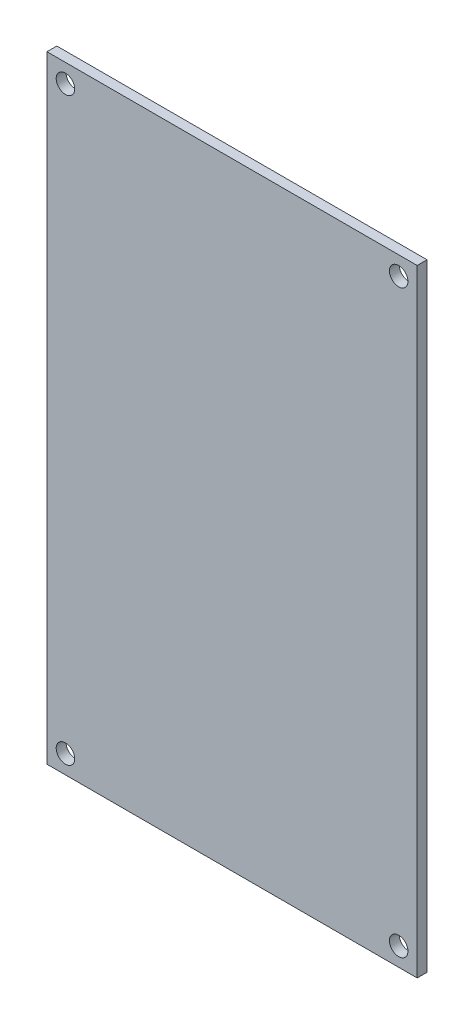
ISO-10303-21;
HEADER;
FILE_DESCRIPTION(('STEP AP214'),'2;1');
FILE_NAME('part.step','',(''),(''),'','','');
FILE_SCHEMA(('AUTOMOTIVE_DESIGN { 1 0 10303 214 1 1 1 1 }'));
ENDSEC;
DATA;
#1=APPLICATION_CONTEXT('core data for automotive mechanical design processes');
#2=APPLICATION_PROTOCOL_DEFINITION('international standard','automotive_design',2000,#1);
#3=PRODUCT_CONTEXT('',#1,'mechanical');
#4=PRODUCT('Part','Part','',(#3));
#5=PRODUCT_RELATED_PRODUCT_CATEGORY('part','',(#4));
#6=PRODUCT_DEFINITION_FORMATION('','',#4);
#7=PRODUCT_DEFINITION_CONTEXT('part definition',#1,'design');
#8=PRODUCT_DEFINITION('design','',#6,#7);
#9=PRODUCT_DEFINITION_SHAPE('','',#8);
#10=(LENGTH_UNIT() NAMED_UNIT(*) SI_UNIT(.MILLI.,.METRE.));
#11=(NAMED_UNIT(*) PLANE_ANGLE_UNIT() SI_UNIT($,.RADIAN.));
#12=(NAMED_UNIT(*) SI_UNIT($,.STERADIAN.) SOLID_ANGLE_UNIT());
#13=UNCERTAINTY_MEASURE_WITH_UNIT(LENGTH_MEASURE(1.E-05),#10,'distance_accuracy_value','');
#14=(GEOMETRIC_REPRESENTATION_CONTEXT(3) GLOBAL_UNCERTAINTY_ASSIGNED_CONTEXT((#13)) GLOBAL_UNIT_ASSIGNED_CONTEXT((#10,
#11,#12)) REPRESENTATION_CONTEXT('',''));
#15=CARTESIAN_POINT('',(0.,0.,0.));
#16=DIRECTION('',(0.,0.,1.));
#17=DIRECTION('',(1.,0.,0.));
#18=AXIS2_PLACEMENT_3D('',#15,#16,#17);
#19=CARTESIAN_POINT('',(0.,0.,1.6));
#20=DIRECTION('',(0.,0.,-1.));
#21=DIRECTION('',(-1.,0.,0.));
#22=AXIS2_PLACEMENT_3D('',#19,#20,#21);
#23=PLANE('',#22);
#24=DIRECTION('',(0.,-1.,0.));
#25=VECTOR('',#24,1.);
#26=CARTESIAN_POINT('',(0.,0.,1.6));
#27=LINE('',#26,#25);
#28=CARTESIAN_POINT('',(0.,100.,1.6));
#29=VERTEX_POINT('',#28);
#30=CARTESIAN_POINT('',(0.,0.,1.6));
#31=VERTEX_POINT('',#30);
#32=EDGE_CURVE('E92',#29,#31,#27,.T.);
#33=ORIENTED_EDGE('',*,*,#32,.T.);
#34=DIRECTION('',(1.,0.,0.));
#35=VECTOR('',#34,1.);
#36=CARTESIAN_POINT('',(0.,0.,1.6));
#37=LINE('',#36,#35);
#38=CARTESIAN_POINT('',(60.,0.,1.6));
#39=VERTEX_POINT('',#38);
#40=EDGE_CURVE('E87',#31,#39,#37,.T.);
#41=ORIENTED_EDGE('',*,*,#40,.T.);
#42=DIRECTION('',(0.,1.,0.));
#43=VECTOR('',#42,1.);
#44=CARTESIAN_POINT('',(60.,0.,1.6));
#45=LINE('',#44,#43);
#46=CARTESIAN_POINT('',(60.,100.,1.6));
#47=VERTEX_POINT('',#46);
#48=EDGE_CURVE('E90',#39,#47,#45,.T.);
#49=ORIENTED_EDGE('',*,*,#48,.T.);
#50=DIRECTION('',(-1.,0.,0.));
#51=VECTOR('',#50,1.);
#52=CARTESIAN_POINT('',(0.,100.,1.6));
#53=LINE('',#52,#51);
#54=EDGE_CURVE('E57',#47,#29,#53,.T.);
#55=ORIENTED_EDGE('',*,*,#54,.T.);
#56=EDGE_LOOP('',(#33,#41,#49,#55));
#57=FACE_BOUND('',#56,.T.);
#58=CARTESIAN_POINT('',(3.,3.,1.6));
#59=DIRECTION('',(0.,0.,1.));
#60=DIRECTION('',(1.,0.,0.));
#61=AXIS2_PLACEMENT_3D('',#58,#59,#60);
#62=CIRCLE('',#61,1.5);
#63=CARTESIAN_POINT('',(4.5,3.,1.6));
#64=VERTEX_POINT('',#63);
#65=EDGE_CURVE('E112',#64,#64,#62,.T.);
#66=ORIENTED_EDGE('',*,*,#65,.F.);
#67=EDGE_LOOP('',(#66));
#68=FACE_BOUND('',#67,.T.);
#69=CARTESIAN_POINT('',(57.,3.,1.6));
#70=DIRECTION('',(0.,0.,1.));
#71=DIRECTION('',(1.,0.,0.));
#72=AXIS2_PLACEMENT_3D('',#69,#70,#71);
#73=CIRCLE('',#72,1.5);
#74=CARTESIAN_POINT('',(58.5,3.,1.6));
#75=VERTEX_POINT('',#74);
#76=EDGE_CURVE('E134',#75,#75,#73,.T.);
#77=ORIENTED_EDGE('',*,*,#76,.F.);
#78=EDGE_LOOP('',(#77));
#79=FACE_BOUND('',#78,.T.);
#80=CARTESIAN_POINT('',(57.,97.,1.6));
#81=DIRECTION('',(0.,0.,1.));
#82=DIRECTION('',(1.,0.,0.));
#83=AXIS2_PLACEMENT_3D('',#80,#81,#82);
#84=CIRCLE('',#83,1.5);
#85=CARTESIAN_POINT('',(58.5,97.,1.6));
#86=VERTEX_POINT('',#85);
#87=EDGE_CURVE('E142',#86,#86,#84,.T.);
#88=ORIENTED_EDGE('',*,*,#87,.F.);
#89=EDGE_LOOP('',(#88));
#90=FACE_BOUND('',#89,.T.);
#91=CARTESIAN_POINT('',(3.,97.,1.6));
#92=DIRECTION('',(0.,0.,1.));
#93=DIRECTION('',(1.,0.,0.));
#94=AXIS2_PLACEMENT_3D('',#91,#92,#93);
#95=CIRCLE('',#94,1.5);
#96=CARTESIAN_POINT('',(4.5,97.,1.6));
#97=VERTEX_POINT('',#96);
#98=EDGE_CURVE('E150',#97,#97,#95,.T.);
#99=ORIENTED_EDGE('',*,*,#98,.F.);
#100=EDGE_LOOP('',(#99));
#101=FACE_BOUND('',#100,.T.);
#102=ADVANCED_FACE('F39',(#57,#68,#79,#90,#101),#23,.F.);
#103=CARTESIAN_POINT('',(0.,0.,0.));
#104=DIRECTION('',(0.,0.,-1.));
#105=DIRECTION('',(-1.,0.,0.));
#106=AXIS2_PLACEMENT_3D('',#103,#104,#105);
#107=PLANE('',#106);
#108=CARTESIAN_POINT('',(57.,97.,0.));
#109=DIRECTION('',(0.,0.,1.));
#110=DIRECTION('',(1.,0.,0.));
#111=AXIS2_PLACEMENT_3D('',#108,#109,#110);
#112=CIRCLE('',#111,1.5);
#113=CARTESIAN_POINT('',(58.5,97.,0.));
#114=VERTEX_POINT('',#113);
#115=EDGE_CURVE('E146',#114,#114,#112,.T.);
#116=ORIENTED_EDGE('',*,*,#115,.T.);
#117=EDGE_LOOP('',(#116));
#118=FACE_BOUND('',#117,.T.);
#119=CARTESIAN_POINT('',(3.,3.,0.));
#120=DIRECTION('',(0.,0.,1.));
#121=DIRECTION('',(1.,0.,0.));
#122=AXIS2_PLACEMENT_3D('',#119,#120,#121);
#123=CIRCLE('',#122,1.5);
#124=CARTESIAN_POINT('',(4.5,3.,0.));
#125=VERTEX_POINT('',#124);
#126=EDGE_CURVE('E130',#125,#125,#123,.T.);
#127=ORIENTED_EDGE('',*,*,#126,.T.);
#128=EDGE_LOOP('',(#127));
#129=FACE_BOUND('',#128,.T.);
#130=DIRECTION('',(0.,-1.,0.));
#131=VECTOR('',#130,1.);
#132=CARTESIAN_POINT('',(0.,0.,0.));
#133=LINE('',#132,#131);
#134=CARTESIAN_POINT('',(0.,100.,0.));
#135=VERTEX_POINT('',#134);
#136=CARTESIAN_POINT('',(0.,0.,0.));
#137=VERTEX_POINT('',#136);
#138=EDGE_CURVE('E108',#135,#137,#133,.T.);
#139=ORIENTED_EDGE('',*,*,#138,.F.);
#140=DIRECTION('',(-1.,0.,0.));
#141=VECTOR('',#140,1.);
#142=CARTESIAN_POINT('',(0.,100.,0.));
#143=LINE('',#142,#141);
#144=CARTESIAN_POINT('',(60.,100.,0.));
#145=VERTEX_POINT('',#144);
#146=EDGE_CURVE('E80',#145,#135,#143,.T.);
#147=ORIENTED_EDGE('',*,*,#146,.F.);
#148=DIRECTION('',(0.,1.,0.));
#149=VECTOR('',#148,1.);
#150=CARTESIAN_POINT('',(60.,0.,0.));
#151=LINE('',#150,#149);
#152=CARTESIAN_POINT('',(60.,0.,0.));
#153=VERTEX_POINT('',#152);
#154=EDGE_CURVE('E74',#153,#145,#151,.T.);
#155=ORIENTED_EDGE('',*,*,#154,.F.);
#156=DIRECTION('',(1.,0.,0.));
#157=VECTOR('',#156,1.);
#158=CARTESIAN_POINT('',(0.,0.,0.));
#159=LINE('',#158,#157);
#160=EDGE_CURVE('E97',#137,#153,#159,.T.);
#161=ORIENTED_EDGE('',*,*,#160,.F.);
#162=EDGE_LOOP('',(#139,#147,#155,#161));
#163=FACE_BOUND('',#162,.T.);
#164=CARTESIAN_POINT('',(57.,3.,0.));
#165=DIRECTION('',(0.,0.,1.));
#166=DIRECTION('',(1.,0.,0.));
#167=AXIS2_PLACEMENT_3D('',#164,#165,#166);
#168=CIRCLE('',#167,1.5);
#169=CARTESIAN_POINT('',(58.5,3.,0.));
#170=VERTEX_POINT('',#169);
#171=EDGE_CURVE('E138',#170,#170,#168,.T.);
#172=ORIENTED_EDGE('',*,*,#171,.T.);
#173=EDGE_LOOP('',(#172));
#174=FACE_BOUND('',#173,.T.);
#175=CARTESIAN_POINT('',(3.,97.,0.));
#176=DIRECTION('',(0.,0.,1.));
#177=DIRECTION('',(1.,0.,0.));
#178=AXIS2_PLACEMENT_3D('',#175,#176,#177);
#179=CIRCLE('',#178,1.5);
#180=CARTESIAN_POINT('',(4.5,97.,0.));
#181=VERTEX_POINT('',#180);
#182=EDGE_CURVE('E154',#181,#181,#179,.T.);
#183=ORIENTED_EDGE('',*,*,#182,.T.);
#184=EDGE_LOOP('',(#183));
#185=FACE_BOUND('',#184,.T.);
#186=ADVANCED_FACE('F125',(#118,#129,#163,#174,#185),#107,.T.);
#187=CARTESIAN_POINT('',(0.,0.,1.6));
#188=DIRECTION('',(1.,0.,0.));
#189=DIRECTION('',(0.,0.,-1.));
#190=AXIS2_PLACEMENT_3D('',#187,#188,#189);
#191=PLANE('',#190);
#192=ORIENTED_EDGE('',*,*,#138,.T.);
#193=DIRECTION('',(0.,0.,-1.));
#194=VECTOR('',#193,1.);
#195=CARTESIAN_POINT('',(0.,0.,1.6));
#196=LINE('',#195,#194);
#197=EDGE_CURVE('E11',#31,#137,#196,.T.);
#198=ORIENTED_EDGE('',*,*,#197,.F.);
#199=ORIENTED_EDGE('',*,*,#32,.F.);
#200=DIRECTION('',(0.,0.,-1.));
#201=VECTOR('',#200,1.);
#202=CARTESIAN_POINT('',(0.,100.,1.6));
#203=LINE('',#202,#201);
#204=EDGE_CURVE('E104',#29,#135,#203,.T.);
#205=ORIENTED_EDGE('',*,*,#204,.T.);
#206=EDGE_LOOP('',(#192,#198,#199,#205));
#207=FACE_BOUND('',#206,.T.);
#208=ADVANCED_FACE('F41',(#207),#191,.F.);
#209=CARTESIAN_POINT('',(0.,0.,1.6));
#210=DIRECTION('',(0.,1.,0.));
#211=DIRECTION('',(0.,0.,1.));
#212=AXIS2_PLACEMENT_3D('',#209,#210,#211);
#213=PLANE('',#212);
#214=ORIENTED_EDGE('',*,*,#160,.T.);
#215=DIRECTION('',(0.,0.,-1.));
#216=VECTOR('',#215,1.);
#217=CARTESIAN_POINT('',(60.,0.,1.6));
#218=LINE('',#217,#216);
#219=EDGE_CURVE('E49',#39,#153,#218,.T.);
#220=ORIENTED_EDGE('',*,*,#219,.F.);
#221=ORIENTED_EDGE('',*,*,#40,.F.);
#222=ORIENTED_EDGE('',*,*,#197,.T.);
#223=EDGE_LOOP('',(#214,#220,#221,#222));
#224=FACE_BOUND('',#223,.T.);
#225=ADVANCED_FACE('F96',(#224),#213,.F.);
#226=CARTESIAN_POINT('',(60.,0.,1.6));
#227=DIRECTION('',(-1.,0.,0.));
#228=DIRECTION('',(0.,0.,1.));
#229=AXIS2_PLACEMENT_3D('',#226,#227,#228);
#230=PLANE('',#229);
#231=ORIENTED_EDGE('',*,*,#154,.T.);
#232=DIRECTION('',(0.,0.,-1.));
#233=VECTOR('',#232,1.);
#234=CARTESIAN_POINT('',(60.,100.,1.6));
#235=LINE('',#234,#233);
#236=EDGE_CURVE('E99',#47,#145,#235,.T.);
#237=ORIENTED_EDGE('',*,*,#236,.F.);
#238=ORIENTED_EDGE('',*,*,#48,.F.);
#239=ORIENTED_EDGE('',*,*,#219,.T.);
#240=EDGE_LOOP('',(#231,#237,#238,#239));
#241=FACE_BOUND('',#240,.T.);
#242=ADVANCED_FACE('F100',(#241),#230,.F.);
#243=CARTESIAN_POINT('',(0.,100.,1.6));
#244=DIRECTION('',(0.,-1.,0.));
#245=DIRECTION('',(0.,0.,-1.));
#246=AXIS2_PLACEMENT_3D('',#243,#244,#245);
#247=PLANE('',#246);
#248=ORIENTED_EDGE('',*,*,#146,.T.);
#249=ORIENTED_EDGE('',*,*,#204,.F.);
#250=ORIENTED_EDGE('',*,*,#54,.F.);
#251=ORIENTED_EDGE('',*,*,#236,.T.);
#252=EDGE_LOOP('',(#248,#249,#250,#251));
#253=FACE_BOUND('',#252,.T.);
#254=ADVANCED_FACE('F122',(#253),#247,.F.);
#255=CARTESIAN_POINT('',(3.,3.,1.6));
#256=DIRECTION('',(0.,0.,-1.));
#257=DIRECTION('',(-1.,0.,0.));
#258=AXIS2_PLACEMENT_3D('',#255,#256,#257);
#259=CYLINDRICAL_SURFACE('',#258,1.5);
#260=ORIENTED_EDGE('',*,*,#65,.T.);
#261=EDGE_LOOP('',(#260));
#262=FACE_BOUND('',#261,.T.);
#263=ORIENTED_EDGE('',*,*,#126,.F.);
#264=EDGE_LOOP('',(#263));
#265=FACE_BOUND('',#264,.T.);
#266=ADVANCED_FACE('F173',(#262,#265),#259,.F.);
#267=CARTESIAN_POINT('',(57.,3.,1.6));
#268=DIRECTION('',(0.,0.,-1.));
#269=DIRECTION('',(-1.,0.,0.));
#270=AXIS2_PLACEMENT_3D('',#267,#268,#269);
#271=CYLINDRICAL_SURFACE('',#270,1.5);
#272=ORIENTED_EDGE('',*,*,#76,.T.);
#273=EDGE_LOOP('',(#272));
#274=FACE_BOUND('',#273,.T.);
#275=ORIENTED_EDGE('',*,*,#171,.F.);
#276=EDGE_LOOP('',(#275));
#277=FACE_BOUND('',#276,.T.);
#278=ADVANCED_FACE('F219',(#274,#277),#271,.F.);
#279=CARTESIAN_POINT('',(57.,97.,1.6));
#280=DIRECTION('',(0.,0.,-1.));
#281=DIRECTION('',(-1.,0.,0.));
#282=AXIS2_PLACEMENT_3D('',#279,#280,#281);
#283=CYLINDRICAL_SURFACE('',#282,1.5);
#284=ORIENTED_EDGE('',*,*,#87,.T.);
#285=EDGE_LOOP('',(#284));
#286=FACE_BOUND('',#285,.T.);
#287=ORIENTED_EDGE('',*,*,#115,.F.);
#288=EDGE_LOOP('',(#287));
#289=FACE_BOUND('',#288,.T.);
#290=ADVANCED_FACE('F227',(#286,#289),#283,.F.);
#291=CARTESIAN_POINT('',(3.,97.,1.6));
#292=DIRECTION('',(0.,0.,-1.));
#293=DIRECTION('',(-1.,0.,0.));
#294=AXIS2_PLACEMENT_3D('',#291,#292,#293);
#295=CYLINDRICAL_SURFACE('',#294,1.5);
#296=ORIENTED_EDGE('',*,*,#98,.T.);
#297=EDGE_LOOP('',(#296));
#298=FACE_BOUND('',#297,.T.);
#299=ORIENTED_EDGE('',*,*,#182,.F.);
#300=EDGE_LOOP('',(#299));
#301=FACE_BOUND('',#300,.T.);
#302=ADVANCED_FACE('F162',(#298,#301),#295,.F.);
#303=CLOSED_SHELL('',(#102,#186,#208,#225,#242,#254,#266,#278,#290,#302));
#304=MANIFOLD_SOLID_BREP('B2',#303);
#305=ADVANCED_BREP_SHAPE_REPRESENTATION('',(#18,#304),#14);
#306=SHAPE_DEFINITION_REPRESENTATION(#9,#305);
ENDSEC;
END-ISO-10303-21;
